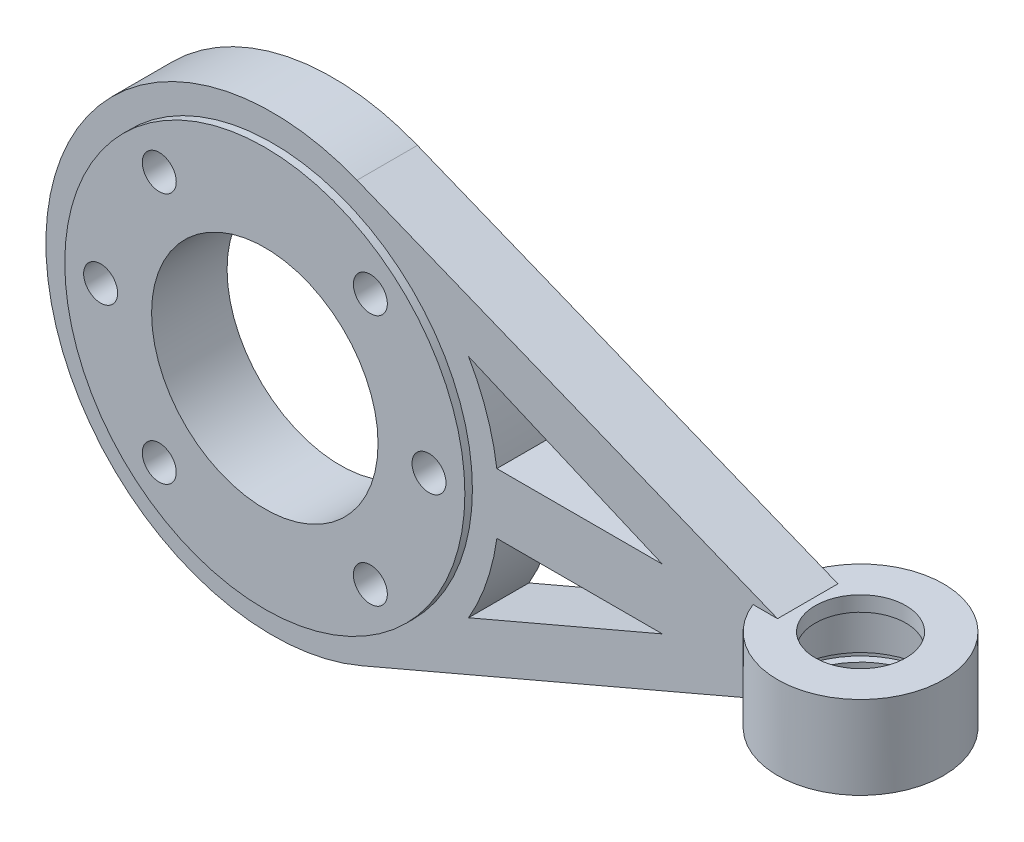
ISO-10303-21;
HEADER;
FILE_DESCRIPTION(('STEP AP214'),'2;1');
FILE_NAME('part.step','',(''),(''),'','','');
FILE_SCHEMA(('AUTOMOTIVE_DESIGN { 1 0 10303 214 1 1 1 1 }'));
ENDSEC;
DATA;
#1=APPLICATION_CONTEXT('core data for automotive mechanical design processes');
#2=APPLICATION_PROTOCOL_DEFINITION('international standard','automotive_design',2000,#1);
#3=PRODUCT_CONTEXT('',#1,'mechanical');
#4=PRODUCT('Part','Part','',(#3));
#5=PRODUCT_RELATED_PRODUCT_CATEGORY('part','',(#4));
#6=PRODUCT_DEFINITION_FORMATION('','',#4);
#7=PRODUCT_DEFINITION_CONTEXT('part definition',#1,'design');
#8=PRODUCT_DEFINITION('design','',#6,#7);
#9=PRODUCT_DEFINITION_SHAPE('','',#8);
#10=(LENGTH_UNIT() NAMED_UNIT(*) SI_UNIT(.MILLI.,.METRE.));
#11=(NAMED_UNIT(*) PLANE_ANGLE_UNIT() SI_UNIT($,.RADIAN.));
#12=(NAMED_UNIT(*) SI_UNIT($,.STERADIAN.) SOLID_ANGLE_UNIT());
#13=UNCERTAINTY_MEASURE_WITH_UNIT(LENGTH_MEASURE(1.E-05),#10,'distance_accuracy_value','');
#14=(GEOMETRIC_REPRESENTATION_CONTEXT(3) GLOBAL_UNCERTAINTY_ASSIGNED_CONTEXT((#13)) GLOBAL_UNIT_ASSIGNED_CONTEXT((#10,
#11,#12)) REPRESENTATION_CONTEXT('',''));
#15=CARTESIAN_POINT('',(0.,0.,0.));
#16=DIRECTION('',(0.,0.,1.));
#17=DIRECTION('',(1.,0.,0.));
#18=AXIS2_PLACEMENT_3D('',#15,#16,#17);
#19=CARTESIAN_POINT('',(73.9156216453703,30.8308441227157,3.));
#20=DIRECTION('',(0.,-1.,0.));
#21=DIRECTION('',(0.,0.,-1.));
#22=AXIS2_PLACEMENT_3D('',#19,#20,#21);
#23=CYLINDRICAL_SURFACE('',#22,9.);
#24=CARTESIAN_POINT('',(73.9156216453703,3.375,3.));
#25=DIRECTION('',(0.,1.,0.));
#26=DIRECTION('',(-1.,0.,0.));
#27=AXIS2_PLACEMENT_3D('',#24,#25,#26);
#28=CIRCLE('',#27,9.);
#29=CARTESIAN_POINT('',(64.9156216453703,3.375,3.));
#30=VERTEX_POINT('',#29);
#31=EDGE_CURVE('E181',#30,#30,#28,.F.);
#32=ORIENTED_EDGE('',*,*,#31,.F.);
#33=EDGE_LOOP('',(#32));
#34=FACE_BOUND('',#33,.T.);
#35=CARTESIAN_POINT('',(73.9156216453703,-3.37500000000002,3.));
#36=DIRECTION('',(0.,-1.,0.));
#37=DIRECTION('',(0.,0.,-1.));
#38=AXIS2_PLACEMENT_3D('',#35,#36,#37);
#39=CIRCLE('',#38,9.);
#40=CARTESIAN_POINT('',(73.9156216453703,-3.37500000000002,-6.));
#41=VERTEX_POINT('',#40);
#42=EDGE_CURVE('E166',#41,#41,#39,.T.);
#43=ORIENTED_EDGE('',*,*,#42,.T.);
#44=EDGE_LOOP('',(#43));
#45=FACE_BOUND('',#44,.T.);
#46=ADVANCED_FACE('F37',(#34,#45),#23,.F.);
#47=CARTESIAN_POINT('',(11.2147311143225,27.824985283616,7.));
#48=DIRECTION('',(-0.373824370477416,-0.927499509453867,0.));
#49=DIRECTION('',(0.927499509453867,-0.373824370477416,0.));
#50=AXIS2_PLACEMENT_3D('',#47,#48,#49);
#51=PLANE('',#50);
#52=DIRECTION('',(-0.927499509453867,0.373824370477416,0.));
#53=VECTOR('',#52,1.);
#54=CARTESIAN_POINT('',(11.2147311143225,27.824985283616,-1.));
#55=LINE('',#54,#53);
#56=CARTESIAN_POINT('',(66.9156216453703,5.375,-1.));
#57=VERTEX_POINT('',#56);
#58=CARTESIAN_POINT('',(11.2147311143225,27.824985283616,-1.));
#59=VERTEX_POINT('',#58);
#60=EDGE_CURVE('E200',#57,#59,#55,.T.);
#61=ORIENTED_EDGE('',*,*,#60,.T.);
#62=DIRECTION('',(0.,0.,-1.));
#63=VECTOR('',#62,1.);
#64=CARTESIAN_POINT('',(11.2147311143225,27.824985283616,7.));
#65=LINE('',#64,#63);
#66=CARTESIAN_POINT('',(11.2147311143225,27.824985283616,7.));
#67=VERTEX_POINT('',#66);
#68=EDGE_CURVE('E219',#67,#59,#65,.T.);
#69=ORIENTED_EDGE('',*,*,#68,.F.);
#70=DIRECTION('',(-0.927499509453867,0.373824370477416,0.));
#71=VECTOR('',#70,1.);
#72=CARTESIAN_POINT('',(11.2147311143225,27.824985283616,7.));
#73=LINE('',#72,#71);
#74=CARTESIAN_POINT('',(66.9156216453703,5.375,7.));
#75=VERTEX_POINT('',#74);
#76=EDGE_CURVE('E201',#75,#67,#73,.T.);
#77=ORIENTED_EDGE('',*,*,#76,.F.);
#78=DIRECTION('',(0.,0.,-1.));
#79=VECTOR('',#78,1.);
#80=CARTESIAN_POINT('',(66.9156216453703,5.375,7.));
#81=LINE('',#80,#79);
#82=EDGE_CURVE('E221',#75,#57,#81,.T.);
#83=ORIENTED_EDGE('',*,*,#82,.T.);
#84=EDGE_LOOP('',(#61,#69,#77,#83));
#85=FACE_BOUND('',#84,.T.);
#86=ADVANCED_FACE('F303',(#85),#51,.F.);
#87=CARTESIAN_POINT('',(11.8010452100285,-27.581430926456,7.));
#88=DIRECTION('',(-0.393368173667616,0.919381030881867,0.));
#89=DIRECTION('',(-0.919381030881867,-0.393368173667616,0.));
#90=AXIS2_PLACEMENT_3D('',#87,#88,#89);
#91=PLANE('',#90);
#92=DIRECTION('',(0.,0.,1.));
#93=VECTOR('',#92,1.);
#94=CARTESIAN_POINT('',(63.1176677813004,-5.62500000000001,7.));
#95=LINE('',#94,#93);
#96=CARTESIAN_POINT('',(63.1176677813004,-5.625,0.90138322950138));
#97=VERTEX_POINT('',#96);
#98=CARTESIAN_POINT('',(63.1176677813004,-5.625,5.09861677049862));
#99=VERTEX_POINT('',#98);
#100=EDGE_CURVE('E230',#97,#99,#95,.T.);
#101=ORIENTED_EDGE('',*,*,#100,.T.);
#102=CARTESIAN_POINT('',(73.9156216453703,-1.00496625100902,3.));
#103=DIRECTION('',(-0.393368173667616,0.919381030881867,0.));
#104=DIRECTION('',(0.919381030881867,0.393368173667616,0.));
#105=AXIS2_PLACEMENT_3D('',#102,#103,#104);
#106=ELLIPSE('',#105,11.9645714132788,11.);
#107=CARTESIAN_POINT('',(63.6686708794107,-5.38924673219444,7.));
#108=VERTEX_POINT('',#107);
#109=EDGE_CURVE('E196',#99,#108,#106,.T.);
#110=ORIENTED_EDGE('',*,*,#109,.T.);
#111=DIRECTION('',(0.919381030881867,0.393368173667616,0.));
#112=VECTOR('',#111,1.);
#113=CARTESIAN_POINT('',(11.8010452100285,-27.581430926456,7.));
#114=LINE('',#113,#112);
#115=CARTESIAN_POINT('',(11.8010452100285,-27.581430926456,7.));
#116=VERTEX_POINT('',#115);
#117=EDGE_CURVE('E207',#116,#108,#114,.T.);
#118=ORIENTED_EDGE('',*,*,#117,.F.);
#119=DIRECTION('',(0.,0.,-1.));
#120=VECTOR('',#119,1.);
#121=CARTESIAN_POINT('',(11.8010452100285,-27.581430926456,7.));
#122=LINE('',#121,#120);
#123=CARTESIAN_POINT('',(11.8010452100285,-27.581430926456,-1.));
#124=VERTEX_POINT('',#123);
#125=EDGE_CURVE('E210',#116,#124,#122,.T.);
#126=ORIENTED_EDGE('',*,*,#125,.T.);
#127=DIRECTION('',(0.919381030881867,0.393368173667616,0.));
#128=VECTOR('',#127,1.);
#129=CARTESIAN_POINT('',(11.8010452100285,-27.581430926456,-1.));
#130=LINE('',#129,#128);
#131=CARTESIAN_POINT('',(63.6686708794107,-5.38924673219444,-1.));
#132=VERTEX_POINT('',#131);
#133=EDGE_CURVE('E205',#124,#132,#130,.T.);
#134=ORIENTED_EDGE('',*,*,#133,.T.);
#135=EDGE_CURVE('E192',#132,#97,#106,.T.);
#136=ORIENTED_EDGE('',*,*,#135,.T.);
#137=EDGE_LOOP('',(#101,#110,#118,#126,#134,#136));
#138=FACE_BOUND('',#137,.T.);
#139=ADVANCED_FACE('F317',(#138),#91,.F.);
#140=CARTESIAN_POINT('',(0.,0.,7.));
#141=DIRECTION('',(0.,0.,1.));
#142=DIRECTION('',(1.,0.,0.));
#143=AXIS2_PLACEMENT_3D('',#140,#141,#142);
#144=PLANE('',#143);
#145=CARTESIAN_POINT('',(0.,0.,7.));
#146=DIRECTION('',(0.,0.,1.));
#147=DIRECTION('',(1.,0.,0.));
#148=AXIS2_PLACEMENT_3D('',#145,#146,#147);
#149=CIRCLE('',#148,30.);
#150=CARTESIAN_POINT('',(29.732137494637,-4.,7.));
#151=VERTEX_POINT('',#150);
#152=CARTESIAN_POINT('',(25.9896947238964,-14.9845176151477,7.));
#153=VERTEX_POINT('',#152);
#154=EDGE_CURVE('E155',#151,#153,#149,.F.);
#155=ORIENTED_EDGE('',*,*,#154,.F.);
#156=DIRECTION('',(-1.,0.,0.));
#157=VECTOR('',#156,1.);
#158=CARTESIAN_POINT('',(0.,-4.,7.));
#159=LINE('',#158,#157);
#160=CARTESIAN_POINT('',(51.6627354139849,-4.,7.));
#161=VERTEX_POINT('',#160);
#162=EDGE_CURVE('E153',#161,#151,#159,.T.);
#163=ORIENTED_EDGE('',*,*,#162,.F.);
#164=DIRECTION('',(0.919381030881867,0.393368173667616,0.));
#165=VECTOR('',#164,1.);
#166=CARTESIAN_POINT('',(9.44083616802279,-22.0651447411648,7.));
#167=LINE('',#166,#165);
#168=EDGE_CURVE('E148',#153,#161,#167,.T.);
#169=ORIENTED_EDGE('',*,*,#168,.F.);
#170=EDGE_LOOP('',(#155,#163,#169));
#171=FACE_BOUND('',#170,.T.);
#172=CARTESIAN_POINT('',(0.,0.,7.));
#173=DIRECTION('',(0.,0.,1.));
#174=DIRECTION('',(1.,0.,0.));
#175=AXIS2_PLACEMENT_3D('',#172,#173,#174);
#176=CIRCLE('',#175,30.);
#177=CARTESIAN_POINT('',(25.9896947238964,14.9845176151477,7.));
#178=VERTEX_POINT('',#177);
#179=CARTESIAN_POINT('',(29.732137494637,4.,7.));
#180=VERTEX_POINT('',#179);
#181=EDGE_CURVE('E146',#178,#180,#176,.F.);
#182=ORIENTED_EDGE('',*,*,#181,.F.);
#183=DIRECTION('',(-0.919381030881867,0.393368173667616,0.));
#184=VECTOR('',#183,1.);
#185=CARTESIAN_POINT('',(9.44083616802279,22.0651447411648,7.));
#186=LINE('',#185,#184);
#187=CARTESIAN_POINT('',(51.6627354139849,4.,7.));
#188=VERTEX_POINT('',#187);
#189=EDGE_CURVE('E132',#188,#178,#186,.T.);
#190=ORIENTED_EDGE('',*,*,#189,.F.);
#191=DIRECTION('',(1.,0.,0.));
#192=VECTOR('',#191,1.);
#193=CARTESIAN_POINT('',(0.,4.,7.));
#194=LINE('',#193,#192);
#195=EDGE_CURVE('E124',#180,#188,#194,.T.);
#196=ORIENTED_EDGE('',*,*,#195,.F.);
#197=EDGE_LOOP('',(#182,#190,#196));
#198=FACE_BOUND('',#197,.T.);
#199=CARTESIAN_POINT('',(0.,0.,7.));
#200=DIRECTION('',(0.,0.,1.));
#201=DIRECTION('',(1.,0.,0.));
#202=AXIS2_PLACEMENT_3D('',#199,#200,#201);
#203=CIRCLE('',#202,26.5);
#204=CARTESIAN_POINT('',(26.5,0.,7.));
#205=VERTEX_POINT('',#204);
#206=EDGE_CURVE('E161',#205,#205,#203,.F.);
#207=ORIENTED_EDGE('',*,*,#206,.T.);
#208=EDGE_LOOP('',(#207));
#209=FACE_BOUND('',#208,.T.);
#210=DIRECTION('',(-1.,0.,0.));
#211=VECTOR('',#210,1.);
#212=CARTESIAN_POINT('',(0.,5.37499999999998,7.));
#213=LINE('',#212,#211);
#214=CARTESIAN_POINT('',(63.6686708794107,5.375,7.));
#215=VERTEX_POINT('',#214);
#216=EDGE_CURVE('E198',#75,#215,#213,.T.);
#217=ORIENTED_EDGE('',*,*,#216,.F.);
#218=ORIENTED_EDGE('',*,*,#76,.T.);
#219=CARTESIAN_POINT('',(0.,0.,7.));
#220=DIRECTION('',(0.,0.,1.));
#221=DIRECTION('',(1.,0.,0.));
#222=AXIS2_PLACEMENT_3D('',#219,#220,#221);
#223=CIRCLE('',#222,30.);
#224=EDGE_CURVE('E204',#67,#116,#223,.T.);
#225=ORIENTED_EDGE('',*,*,#224,.T.);
#226=ORIENTED_EDGE('',*,*,#117,.T.);
#227=DIRECTION('',(0.,1.,0.));
#228=VECTOR('',#227,1.);
#229=CARTESIAN_POINT('',(63.6686708794107,22.7172907254557,7.));
#230=LINE('',#229,#228);
#231=EDGE_CURVE('E195',#215,#108,#230,.F.);
#232=ORIENTED_EDGE('',*,*,#231,.F.);
#233=EDGE_LOOP('',(#217,#218,#225,#226,#232));
#234=FACE_BOUND('',#233,.T.);
#235=ADVANCED_FACE('F144',(#171,#198,#209,#234),#144,.T.);
#236=CARTESIAN_POINT('',(0.,0.,-1.));
#237=DIRECTION('',(0.,0.,1.));
#238=DIRECTION('',(1.,0.,0.));
#239=AXIS2_PLACEMENT_3D('',#236,#237,#238);
#240=PLANE('',#239);
#241=DIRECTION('',(-1.,0.,0.));
#242=VECTOR('',#241,1.);
#243=CARTESIAN_POINT('',(0.,-4.,-1.));
#244=LINE('',#243,#242);
#245=CARTESIAN_POINT('',(51.6627354139849,-4.,-1.));
#246=VERTEX_POINT('',#245);
#247=CARTESIAN_POINT('',(29.732137494637,-4.,-1.));
#248=VERTEX_POINT('',#247);
#249=EDGE_CURVE('E45',#246,#248,#244,.T.);
#250=ORIENTED_EDGE('',*,*,#249,.T.);
#251=CARTESIAN_POINT('',(0.,0.,-1.));
#252=DIRECTION('',(0.,0.,1.));
#253=DIRECTION('',(1.,0.,0.));
#254=AXIS2_PLACEMENT_3D('',#251,#252,#253);
#255=CIRCLE('',#254,30.);
#256=CARTESIAN_POINT('',(25.9896947238964,-14.9845176151477,-1.));
#257=VERTEX_POINT('',#256);
#258=EDGE_CURVE('E12',#248,#257,#255,.F.);
#259=ORIENTED_EDGE('',*,*,#258,.T.);
#260=DIRECTION('',(0.919381030881867,0.393368173667616,0.));
#261=VECTOR('',#260,1.);
#262=CARTESIAN_POINT('',(9.44083616802279,-22.0651447411648,-1.));
#263=LINE('',#262,#261);
#264=EDGE_CURVE('E250',#257,#246,#263,.T.);
#265=ORIENTED_EDGE('',*,*,#264,.T.);
#266=EDGE_LOOP('',(#250,#259,#265));
#267=FACE_BOUND('',#266,.T.);
#268=DIRECTION('',(-0.919381030881867,0.393368173667616,0.));
#269=VECTOR('',#268,1.);
#270=CARTESIAN_POINT('',(9.44083616802279,22.0651447411648,-1.));
#271=LINE('',#270,#269);
#272=CARTESIAN_POINT('',(51.6627354139849,4.,-1.));
#273=VERTEX_POINT('',#272);
#274=CARTESIAN_POINT('',(25.9896947238964,14.9845176151477,-1.));
#275=VERTEX_POINT('',#274);
#276=EDGE_CURVE('E140',#273,#275,#271,.T.);
#277=ORIENTED_EDGE('',*,*,#276,.T.);
#278=CARTESIAN_POINT('',(0.,0.,-1.));
#279=DIRECTION('',(0.,0.,1.));
#280=DIRECTION('',(1.,0.,0.));
#281=AXIS2_PLACEMENT_3D('',#278,#279,#280);
#282=CIRCLE('',#281,30.);
#283=CARTESIAN_POINT('',(29.732137494637,4.,-1.));
#284=VERTEX_POINT('',#283);
#285=EDGE_CURVE('E247',#275,#284,#282,.F.);
#286=ORIENTED_EDGE('',*,*,#285,.T.);
#287=DIRECTION('',(1.,0.,0.));
#288=VECTOR('',#287,1.);
#289=CARTESIAN_POINT('',(0.,4.,-1.));
#290=LINE('',#289,#288);
#291=EDGE_CURVE('E240',#284,#273,#290,.T.);
#292=ORIENTED_EDGE('',*,*,#291,.T.);
#293=EDGE_LOOP('',(#277,#286,#292));
#294=FACE_BOUND('',#293,.T.);
#295=CARTESIAN_POINT('',(0.,0.,-1.));
#296=DIRECTION('',(0.,0.,1.));
#297=DIRECTION('',(1.,0.,0.));
#298=AXIS2_PLACEMENT_3D('',#295,#296,#297);
#299=CIRCLE('',#298,26.5);
#300=CARTESIAN_POINT('',(26.5,0.,-1.));
#301=VERTEX_POINT('',#300);
#302=EDGE_CURVE('E233',#301,#301,#299,.F.);
#303=ORIENTED_EDGE('',*,*,#302,.F.);
#304=EDGE_LOOP('',(#303));
#305=FACE_BOUND('',#304,.T.);
#306=ORIENTED_EDGE('',*,*,#60,.F.);
#307=DIRECTION('',(-1.,0.,0.));
#308=VECTOR('',#307,1.);
#309=CARTESIAN_POINT('',(0.,5.37499999999998,-1.));
#310=LINE('',#309,#308);
#311=CARTESIAN_POINT('',(63.6686708794107,5.375,-1.));
#312=VERTEX_POINT('',#311);
#313=EDGE_CURVE('E227',#57,#312,#310,.T.);
#314=ORIENTED_EDGE('',*,*,#313,.T.);
#315=DIRECTION('',(0.,1.,0.));
#316=VECTOR('',#315,1.);
#317=CARTESIAN_POINT('',(63.6686708794107,22.7172907254557,-1.));
#318=LINE('',#317,#316);
#319=EDGE_CURVE('E224',#312,#132,#318,.F.);
#320=ORIENTED_EDGE('',*,*,#319,.T.);
#321=ORIENTED_EDGE('',*,*,#133,.F.);
#322=CARTESIAN_POINT('',(0.,0.,-1.));
#323=DIRECTION('',(0.,0.,1.));
#324=DIRECTION('',(1.,0.,0.));
#325=AXIS2_PLACEMENT_3D('',#322,#323,#324);
#326=CIRCLE('',#325,30.);
#327=EDGE_CURVE('E213',#59,#124,#326,.T.);
#328=ORIENTED_EDGE('',*,*,#327,.F.);
#329=EDGE_LOOP('',(#306,#314,#320,#321,#328));
#330=FACE_BOUND('',#329,.T.);
#331=ADVANCED_FACE('F255',(#267,#294,#305,#330),#240,.F.);
#332=CARTESIAN_POINT('',(0.,0.,3.));
#333=DIRECTION('',(0.,0.,-1.));
#334=DIRECTION('',(-1.,0.,0.));
#335=AXIS2_PLACEMENT_3D('',#332,#333,#334);
#336=CYLINDRICAL_SURFACE('',#335,30.);
#337=ORIENTED_EDGE('',*,*,#327,.T.);
#338=ORIENTED_EDGE('',*,*,#125,.F.);
#339=ORIENTED_EDGE('',*,*,#224,.F.);
#340=ORIENTED_EDGE('',*,*,#68,.T.);
#341=EDGE_LOOP('',(#337,#338,#339,#340));
#342=FACE_BOUND('',#341,.T.);
#343=ADVANCED_FACE('F39',(#342),#336,.T.);
#344=CARTESIAN_POINT('',(62.9156216453703,-5.625,3.));
#345=DIRECTION('',(0.,-1.,0.));
#346=DIRECTION('',(1.,0.,0.));
#347=AXIS2_PLACEMENT_3D('',#344,#345,#346);
#348=PLANE('',#347);
#349=CARTESIAN_POINT('',(73.9156216453703,-5.62500000000002,3.));
#350=DIRECTION('',(0.,-1.,0.));
#351=DIRECTION('',(0.,0.,-1.));
#352=AXIS2_PLACEMENT_3D('',#349,#350,#351);
#353=CIRCLE('',#352,9.);
#354=CARTESIAN_POINT('',(73.9156216453703,-5.62500000000002,-6.));
#355=VERTEX_POINT('',#354);
#356=EDGE_CURVE('E174',#355,#355,#353,.T.);
#357=ORIENTED_EDGE('',*,*,#356,.F.);
#358=EDGE_LOOP('',(#357));
#359=FACE_BOUND('',#358,.T.);
#360=ORIENTED_EDGE('',*,*,#100,.F.);
#361=CARTESIAN_POINT('',(73.9156216453703,-5.625,3.));
#362=DIRECTION('',(0.,1.,0.));
#363=DIRECTION('',(-1.,0.,0.));
#364=AXIS2_PLACEMENT_3D('',#361,#362,#363);
#365=CIRCLE('',#364,11.);
#366=EDGE_CURVE('E185',#99,#97,#365,.T.);
#367=ORIENTED_EDGE('',*,*,#366,.F.);
#368=EDGE_LOOP('',(#360,#367));
#369=FACE_BOUND('',#368,.T.);
#370=ADVANCED_FACE('F319',(#359,#369),#348,.T.);
#371=CARTESIAN_POINT('',(73.9156216453703,22.7172907254557,3.));
#372=DIRECTION('',(0.,1.,0.));
#373=DIRECTION('',(-1.,0.,0.));
#374=AXIS2_PLACEMENT_3D('',#371,#372,#373);
#375=CYLINDRICAL_SURFACE('',#374,11.);
#376=ORIENTED_EDGE('',*,*,#109,.F.);
#377=ORIENTED_EDGE('',*,*,#366,.T.);
#378=ORIENTED_EDGE('',*,*,#135,.F.);
#379=ORIENTED_EDGE('',*,*,#319,.F.);
#380=CARTESIAN_POINT('',(73.9156216453703,5.375,3.));
#381=DIRECTION('',(0.,1.,0.));
#382=DIRECTION('',(-1.,0.,0.));
#383=AXIS2_PLACEMENT_3D('',#380,#381,#382);
#384=CIRCLE('',#383,11.);
#385=EDGE_CURVE('E188',#215,#312,#384,.T.);
#386=ORIENTED_EDGE('',*,*,#385,.F.);
#387=ORIENTED_EDGE('',*,*,#231,.T.);
#388=EDGE_LOOP('',(#376,#377,#378,#379,#386,#387));
#389=FACE_BOUND('',#388,.T.);
#390=ADVANCED_FACE('F314',(#389),#375,.T.);
#391=CARTESIAN_POINT('',(62.9156216453703,5.375,3.));
#392=DIRECTION('',(0.,1.,0.));
#393=DIRECTION('',(-1.,0.,0.));
#394=AXIS2_PLACEMENT_3D('',#391,#392,#393);
#395=PLANE('',#394);
#396=CARTESIAN_POINT('',(73.9156216453703,5.375,3.));
#397=DIRECTION('',(0.,1.,0.));
#398=DIRECTION('',(-1.,0.,0.));
#399=AXIS2_PLACEMENT_3D('',#396,#397,#398);
#400=CIRCLE('',#399,6.);
#401=CARTESIAN_POINT('',(67.9156216453703,5.375,3.));
#402=VERTEX_POINT('',#401);
#403=EDGE_CURVE('E189',#402,#402,#400,.T.);
#404=ORIENTED_EDGE('',*,*,#403,.F.);
#405=EDGE_LOOP('',(#404));
#406=FACE_BOUND('',#405,.T.);
#407=ORIENTED_EDGE('',*,*,#82,.F.);
#408=ORIENTED_EDGE('',*,*,#216,.T.);
#409=ORIENTED_EDGE('',*,*,#385,.T.);
#410=ORIENTED_EDGE('',*,*,#313,.F.);
#411=EDGE_LOOP('',(#407,#408,#409,#410));
#412=FACE_BOUND('',#411,.T.);
#413=ADVANCED_FACE('F306',(#406,#412),#395,.T.);
#414=CARTESIAN_POINT('',(73.9156216453703,19.375,3.));
#415=DIRECTION('',(0.,-1.,0.));
#416=DIRECTION('',(0.,0.,-1.));
#417=AXIS2_PLACEMENT_3D('',#414,#415,#416);
#418=CYLINDRICAL_SURFACE('',#417,6.);
#419=CARTESIAN_POINT('',(73.9156216453703,3.375,3.));
#420=DIRECTION('',(0.,1.,0.));
#421=DIRECTION('',(-1.,0.,0.));
#422=AXIS2_PLACEMENT_3D('',#419,#420,#421);
#423=CIRCLE('',#422,6.);
#424=CARTESIAN_POINT('',(67.9156216453703,3.375,3.));
#425=VERTEX_POINT('',#424);
#426=EDGE_CURVE('E184',#425,#425,#423,.F.);
#427=ORIENTED_EDGE('',*,*,#426,.T.);
#428=EDGE_LOOP('',(#427));
#429=FACE_BOUND('',#428,.T.);
#430=ORIENTED_EDGE('',*,*,#403,.T.);
#431=EDGE_LOOP('',(#430));
#432=FACE_BOUND('',#431,.T.);
#433=ADVANCED_FACE('F349',(#429,#432),#418,.F.);
#434=CARTESIAN_POINT('',(62.9156216453703,3.375,3.));
#435=DIRECTION('',(0.,1.,0.));
#436=DIRECTION('',(-1.,0.,0.));
#437=AXIS2_PLACEMENT_3D('',#434,#435,#436);
#438=PLANE('',#437);
#439=ORIENTED_EDGE('',*,*,#31,.T.);
#440=EDGE_LOOP('',(#439));
#441=FACE_BOUND('',#440,.T.);
#442=ORIENTED_EDGE('',*,*,#426,.F.);
#443=EDGE_LOOP('',(#442));
#444=FACE_BOUND('',#443,.T.);
#445=ADVANCED_FACE('F341',(#441,#444),#438,.F.);
#446=CARTESIAN_POINT('',(73.9156216453703,-4.47500000000002,3.));
#447=DIRECTION('',(0.,-1.,0.));
#448=DIRECTION('',(0.,0.,-1.));
#449=AXIS2_PLACEMENT_3D('',#446,#447,#448);
#450=CIRCLE('',#449,9.);
#451=CARTESIAN_POINT('',(73.9156216453703,-4.47500000000002,-6.));
#452=VERTEX_POINT('',#451);
#453=EDGE_CURVE('E167',#452,#452,#450,.T.);
#454=ORIENTED_EDGE('',*,*,#453,.F.);
#455=EDGE_LOOP('',(#454));
#456=FACE_BOUND('',#455,.T.);
#457=ORIENTED_EDGE('',*,*,#356,.T.);
#458=EDGE_LOOP('',(#457));
#459=FACE_BOUND('',#458,.T.);
#460=ADVANCED_FACE('F331',(#456,#459),#23,.F.);
#461=CARTESIAN_POINT('',(73.9156216453703,-4.47500000000002,3.));
#462=DIRECTION('',(0.,1.,0.));
#463=DIRECTION('',(0.,0.,1.));
#464=AXIS2_PLACEMENT_3D('',#461,#462,#463);
#465=CYLINDRICAL_SURFACE('',#464,9.99999999999999);
#466=CARTESIAN_POINT('',(73.9156216453703,-4.47500000000002,3.));
#467=DIRECTION('',(0.,-1.,0.));
#468=DIRECTION('',(0.,0.,-1.));
#469=AXIS2_PLACEMENT_3D('',#466,#467,#468);
#470=CIRCLE('',#469,9.99999999999999);
#471=CARTESIAN_POINT('',(73.9156216453703,-4.47500000000002,-6.99999999999999));
#472=VERTEX_POINT('',#471);
#473=EDGE_CURVE('E170',#472,#472,#470,.T.);
#474=ORIENTED_EDGE('',*,*,#473,.T.);
#475=EDGE_LOOP('',(#474));
#476=FACE_BOUND('',#475,.T.);
#477=CARTESIAN_POINT('',(73.9156216453703,-3.37500000000002,3.));
#478=DIRECTION('',(0.,-1.,0.));
#479=DIRECTION('',(0.,0.,-1.));
#480=AXIS2_PLACEMENT_3D('',#477,#478,#479);
#481=CIRCLE('',#480,9.99999999999999);
#482=CARTESIAN_POINT('',(73.9156216453703,-3.37500000000002,-6.99999999999999));
#483=VERTEX_POINT('',#482);
#484=EDGE_CURVE('E171',#483,#483,#481,.T.);
#485=ORIENTED_EDGE('',*,*,#484,.F.);
#486=EDGE_LOOP('',(#485));
#487=FACE_BOUND('',#486,.T.);
#488=ADVANCED_FACE('F340',(#476,#487),#465,.F.);
#489=CARTESIAN_POINT('',(0.,-4.47500000000002,0.));
#490=DIRECTION('',(0.,-1.,0.));
#491=DIRECTION('',(0.,0.,-1.));
#492=AXIS2_PLACEMENT_3D('',#489,#490,#491);
#493=PLANE('',#492);
#494=ORIENTED_EDGE('',*,*,#453,.T.);
#495=EDGE_LOOP('',(#494));
#496=FACE_BOUND('',#495,.T.);
#497=ORIENTED_EDGE('',*,*,#473,.F.);
#498=EDGE_LOOP('',(#497));
#499=FACE_BOUND('',#498,.T.);
#500=ADVANCED_FACE('F347',(#496,#499),#493,.F.);
#501=CARTESIAN_POINT('',(0.,-3.37500000000002,0.));
#502=DIRECTION('',(0.,-1.,0.));
#503=DIRECTION('',(0.,0.,-1.));
#504=AXIS2_PLACEMENT_3D('',#501,#502,#503);
#505=PLANE('',#504);
#506=ORIENTED_EDGE('',*,*,#42,.F.);
#507=EDGE_LOOP('',(#506));
#508=FACE_BOUND('',#507,.T.);
#509=ORIENTED_EDGE('',*,*,#484,.T.);
#510=EDGE_LOOP('',(#509));
#511=FACE_BOUND('',#510,.T.);
#512=ADVANCED_FACE('F284',(#508,#511),#505,.T.);
#513=CARTESIAN_POINT('',(0.,0.,-2.));
#514=DIRECTION('',(0.,0.,-1.));
#515=DIRECTION('',(-1.,0.,0.));
#516=AXIS2_PLACEMENT_3D('',#513,#514,#515);
#517=PLANE('',#516);
#518=CARTESIAN_POINT('',(21.75,0.,-2.));
#519=DIRECTION('',(0.,0.,-1.));
#520=DIRECTION('',(-1.,0.,0.));
#521=AXIS2_PLACEMENT_3D('',#518,#519,#520);
#522=CIRCLE('',#521,2.25);
#523=CARTESIAN_POINT('',(19.5,0.,-2.));
#524=VERTEX_POINT('',#523);
#525=EDGE_CURVE('E269',#524,#524,#522,.T.);
#526=ORIENTED_EDGE('',*,*,#525,.F.);
#527=EDGE_LOOP('',(#526));
#528=FACE_BOUND('',#527,.T.);
#529=CARTESIAN_POINT('',(-13.9806305106822,16.6614666378378,-2.));
#530=DIRECTION('',(0.,0.,-1.));
#531=DIRECTION('',(-1.,0.,0.));
#532=AXIS2_PLACEMENT_3D('',#529,#530,#531);
#533=CIRCLE('',#532,2.25);
#534=CARTESIAN_POINT('',(-16.2306305106822,16.6614666378378,-2.));
#535=VERTEX_POINT('',#534);
#536=EDGE_CURVE('E452',#535,#535,#533,.T.);
#537=ORIENTED_EDGE('',*,*,#536,.F.);
#538=EDGE_LOOP('',(#537));
#539=FACE_BOUND('',#538,.T.);
#540=CARTESIAN_POINT('',(13.9806305106822,-16.6614666378378,-2.));
#541=DIRECTION('',(0.,0.,-1.));
#542=DIRECTION('',(-1.,0.,0.));
#543=AXIS2_PLACEMENT_3D('',#540,#541,#542);
#544=CIRCLE('',#543,2.25);
#545=CARTESIAN_POINT('',(11.7306305106822,-16.6614666378378,-2.));
#546=VERTEX_POINT('',#545);
#547=EDGE_CURVE('E450',#546,#546,#544,.T.);
#548=ORIENTED_EDGE('',*,*,#547,.F.);
#549=EDGE_LOOP('',(#548));
#550=FACE_BOUND('',#549,.T.);
#551=CARTESIAN_POINT('',(-21.75,0.,-2.));
#552=DIRECTION('',(0.,0.,-1.));
#553=DIRECTION('',(-1.,0.,0.));
#554=AXIS2_PLACEMENT_3D('',#551,#552,#553);
#555=CIRCLE('',#554,2.25);
#556=CARTESIAN_POINT('',(-24.,0.,-2.));
#557=VERTEX_POINT('',#556);
#558=EDGE_CURVE('E447',#557,#557,#555,.T.);
#559=ORIENTED_EDGE('',*,*,#558,.F.);
#560=EDGE_LOOP('',(#559));
#561=FACE_BOUND('',#560,.T.);
#562=CARTESIAN_POINT('',(-13.9806305106822,-16.6614666378378,-2.));
#563=DIRECTION('',(0.,0.,-1.));
#564=DIRECTION('',(-1.,0.,0.));
#565=AXIS2_PLACEMENT_3D('',#562,#563,#564);
#566=CIRCLE('',#565,2.25);
#567=CARTESIAN_POINT('',(-16.2306305106822,-16.6614666378378,-2.));
#568=VERTEX_POINT('',#567);
#569=EDGE_CURVE('E428',#568,#568,#566,.T.);
#570=ORIENTED_EDGE('',*,*,#569,.F.);
#571=EDGE_LOOP('',(#570));
#572=FACE_BOUND('',#571,.T.);
#573=CARTESIAN_POINT('',(13.9806305106822,16.6614666378378,-2.));
#574=DIRECTION('',(0.,0.,-1.));
#575=DIRECTION('',(-1.,0.,0.));
#576=AXIS2_PLACEMENT_3D('',#573,#574,#575);
#577=CIRCLE('',#576,2.25);
#578=CARTESIAN_POINT('',(11.7306305106822,16.6614666378378,-2.));
#579=VERTEX_POINT('',#578);
#580=EDGE_CURVE('E424',#579,#579,#577,.T.);
#581=ORIENTED_EDGE('',*,*,#580,.F.);
#582=EDGE_LOOP('',(#581));
#583=FACE_BOUND('',#582,.T.);
#584=CARTESIAN_POINT('',(0.,0.,-2.));
#585=DIRECTION('',(0.,0.,-1.));
#586=DIRECTION('',(-1.,0.,0.));
#587=AXIS2_PLACEMENT_3D('',#584,#585,#586);
#588=CIRCLE('',#587,15.);
#589=CARTESIAN_POINT('',(-15.,0.,-2.));
#590=VERTEX_POINT('',#589);
#591=EDGE_CURVE('E133',#590,#590,#588,.T.);
#592=ORIENTED_EDGE('',*,*,#591,.F.);
#593=EDGE_LOOP('',(#592));
#594=FACE_BOUND('',#593,.T.);
#595=CARTESIAN_POINT('',(0.,0.,-2.));
#596=DIRECTION('',(0.,0.,-1.));
#597=DIRECTION('',(-1.,0.,0.));
#598=AXIS2_PLACEMENT_3D('',#595,#596,#597);
#599=CIRCLE('',#598,26.5);
#600=CARTESIAN_POINT('',(-26.5,0.,-2.));
#601=VERTEX_POINT('',#600);
#602=EDGE_CURVE('E158',#601,#601,#599,.T.);
#603=ORIENTED_EDGE('',*,*,#602,.T.);
#604=EDGE_LOOP('',(#603));
#605=FACE_BOUND('',#604,.T.);
#606=ADVANCED_FACE('F280',(#528,#539,#550,#561,#572,#583,#594,#605),#517,.T.);
#607=CARTESIAN_POINT('',(0.,0.,-2.));
#608=DIRECTION('',(0.,0.,1.));
#609=DIRECTION('',(1.,0.,0.));
#610=AXIS2_PLACEMENT_3D('',#607,#608,#609);
#611=CYLINDRICAL_SURFACE('',#610,26.5);
#612=ORIENTED_EDGE('',*,*,#602,.F.);
#613=EDGE_LOOP('',(#612));
#614=FACE_BOUND('',#613,.T.);
#615=ORIENTED_EDGE('',*,*,#302,.T.);
#616=EDGE_LOOP('',(#615));
#617=FACE_BOUND('',#616,.T.);
#618=ADVANCED_FACE('F283',(#614,#617),#611,.T.);
#619=ORIENTED_EDGE('',*,*,#206,.F.);
#620=EDGE_LOOP('',(#619));
#621=FACE_BOUND('',#620,.T.);
#622=CARTESIAN_POINT('',(0.,0.,8.));
#623=DIRECTION('',(0.,0.,-1.));
#624=DIRECTION('',(-1.,0.,0.));
#625=AXIS2_PLACEMENT_3D('',#622,#623,#624);
#626=CIRCLE('',#625,26.5);
#627=CARTESIAN_POINT('',(-26.5,0.,8.));
#628=VERTEX_POINT('',#627);
#629=EDGE_CURVE('E157',#628,#628,#626,.T.);
#630=ORIENTED_EDGE('',*,*,#629,.T.);
#631=EDGE_LOOP('',(#630));
#632=FACE_BOUND('',#631,.T.);
#633=ADVANCED_FACE('F291',(#621,#632),#611,.T.);
#634=CARTESIAN_POINT('',(0.,0.,8.));
#635=DIRECTION('',(0.,0.,-1.));
#636=DIRECTION('',(-1.,0.,0.));
#637=AXIS2_PLACEMENT_3D('',#634,#635,#636);
#638=PLANE('',#637);
#639=CARTESIAN_POINT('',(21.75,0.,8.));
#640=DIRECTION('',(0.,0.,1.));
#641=DIRECTION('',(1.,0.,0.));
#642=AXIS2_PLACEMENT_3D('',#639,#640,#641);
#643=CIRCLE('',#642,2.25);
#644=CARTESIAN_POINT('',(24.,0.,8.));
#645=VERTEX_POINT('',#644);
#646=EDGE_CURVE('E423',#645,#645,#643,.T.);
#647=ORIENTED_EDGE('',*,*,#646,.F.);
#648=EDGE_LOOP('',(#647));
#649=FACE_BOUND('',#648,.T.);
#650=CARTESIAN_POINT('',(-13.9806305106822,16.6614666378378,8.));
#651=DIRECTION('',(0.,0.,1.));
#652=DIRECTION('',(1.,0.,0.));
#653=AXIS2_PLACEMENT_3D('',#650,#651,#652);
#654=CIRCLE('',#653,2.25);
#655=CARTESIAN_POINT('',(-11.7306305106822,16.6614666378378,8.));
#656=VERTEX_POINT('',#655);
#657=EDGE_CURVE('E434',#656,#656,#654,.T.);
#658=ORIENTED_EDGE('',*,*,#657,.F.);
#659=EDGE_LOOP('',(#658));
#660=FACE_BOUND('',#659,.T.);
#661=CARTESIAN_POINT('',(13.9806305106822,-16.6614666378378,8.));
#662=DIRECTION('',(0.,0.,1.));
#663=DIRECTION('',(1.,0.,0.));
#664=AXIS2_PLACEMENT_3D('',#661,#662,#663);
#665=CIRCLE('',#664,2.25);
#666=CARTESIAN_POINT('',(16.2306305106822,-16.6614666378378,8.));
#667=VERTEX_POINT('',#666);
#668=EDGE_CURVE('E425',#667,#667,#665,.T.);
#669=ORIENTED_EDGE('',*,*,#668,.F.);
#670=EDGE_LOOP('',(#669));
#671=FACE_BOUND('',#670,.T.);
#672=CARTESIAN_POINT('',(-21.75,0.,8.));
#673=DIRECTION('',(0.,0.,1.));
#674=DIRECTION('',(-1.,0.,0.));
#675=AXIS2_PLACEMENT_3D('',#672,#673,#674);
#676=CIRCLE('',#675,2.25);
#677=CARTESIAN_POINT('',(-24.,0.,8.));
#678=VERTEX_POINT('',#677);
#679=EDGE_CURVE('E431',#678,#678,#676,.T.);
#680=ORIENTED_EDGE('',*,*,#679,.F.);
#681=EDGE_LOOP('',(#680));
#682=FACE_BOUND('',#681,.T.);
#683=CARTESIAN_POINT('',(-13.9806305106822,-16.6614666378378,8.));
#684=DIRECTION('',(0.,0.,1.));
#685=DIRECTION('',(-1.,0.,0.));
#686=AXIS2_PLACEMENT_3D('',#683,#684,#685);
#687=CIRCLE('',#686,2.25);
#688=CARTESIAN_POINT('',(-16.2306305106822,-16.6614666378378,8.));
#689=VERTEX_POINT('',#688);
#690=EDGE_CURVE('E438',#689,#689,#687,.T.);
#691=ORIENTED_EDGE('',*,*,#690,.F.);
#692=EDGE_LOOP('',(#691));
#693=FACE_BOUND('',#692,.T.);
#694=CARTESIAN_POINT('',(13.9806305106822,16.6614666378378,8.));
#695=DIRECTION('',(0.,0.,1.));
#696=DIRECTION('',(-1.,0.,0.));
#697=AXIS2_PLACEMENT_3D('',#694,#695,#696);
#698=CIRCLE('',#697,2.25);
#699=CARTESIAN_POINT('',(11.7306305106822,16.6614666378378,8.));
#700=VERTEX_POINT('',#699);
#701=EDGE_CURVE('E437',#700,#700,#698,.T.);
#702=ORIENTED_EDGE('',*,*,#701,.F.);
#703=EDGE_LOOP('',(#702));
#704=FACE_BOUND('',#703,.T.);
#705=CARTESIAN_POINT('',(0.,0.,8.));
#706=DIRECTION('',(0.,0.,-1.));
#707=DIRECTION('',(-1.,0.,0.));
#708=AXIS2_PLACEMENT_3D('',#705,#706,#707);
#709=CIRCLE('',#708,15.);
#710=CARTESIAN_POINT('',(-15.,0.,8.));
#711=VERTEX_POINT('',#710);
#712=EDGE_CURVE('E241',#711,#711,#709,.T.);
#713=ORIENTED_EDGE('',*,*,#712,.T.);
#714=EDGE_LOOP('',(#713));
#715=FACE_BOUND('',#714,.T.);
#716=ORIENTED_EDGE('',*,*,#629,.F.);
#717=EDGE_LOOP('',(#716));
#718=FACE_BOUND('',#717,.T.);
#719=ADVANCED_FACE('F370',(#649,#660,#671,#682,#693,#704,#715,#718),#638,.F.);
#720=CARTESIAN_POINT('',(0.,0.,-8.));
#721=DIRECTION('',(0.,0.,1.));
#722=DIRECTION('',(1.,0.,0.));
#723=AXIS2_PLACEMENT_3D('',#720,#721,#722);
#724=CYLINDRICAL_SURFACE('',#723,15.);
#725=ORIENTED_EDGE('',*,*,#591,.T.);
#726=EDGE_LOOP('',(#725));
#727=FACE_BOUND('',#726,.T.);
#728=ORIENTED_EDGE('',*,*,#712,.F.);
#729=EDGE_LOOP('',(#728));
#730=FACE_BOUND('',#729,.T.);
#731=ADVANCED_FACE('F277',(#727,#730),#724,.F.);
#732=CARTESIAN_POINT('',(0.,0.,-8.));
#733=DIRECTION('',(0.,0.,1.));
#734=DIRECTION('',(1.,0.,0.));
#735=AXIS2_PLACEMENT_3D('',#732,#733,#734);
#736=CYLINDRICAL_SURFACE('',#735,30.);
#737=ORIENTED_EDGE('',*,*,#181,.T.);
#738=DIRECTION('',(0.,0.,1.));
#739=VECTOR('',#738,1.);
#740=CARTESIAN_POINT('',(29.732137494637,4.,-8.));
#741=LINE('',#740,#739);
#742=EDGE_CURVE('E60',#284,#180,#741,.T.);
#743=ORIENTED_EDGE('',*,*,#742,.F.);
#744=ORIENTED_EDGE('',*,*,#285,.F.);
#745=DIRECTION('',(0.,0.,1.));
#746=VECTOR('',#745,1.);
#747=CARTESIAN_POINT('',(25.9896947238964,14.9845176151477,-8.));
#748=LINE('',#747,#746);
#749=EDGE_CURVE('E142',#275,#178,#748,.T.);
#750=ORIENTED_EDGE('',*,*,#749,.T.);
#751=EDGE_LOOP('',(#737,#743,#744,#750));
#752=FACE_BOUND('',#751,.T.);
#753=ADVANCED_FACE('F375',(#752),#736,.T.);
#754=CARTESIAN_POINT('',(25.9896947238964,14.9845176151477,-8.));
#755=DIRECTION('',(0.393368173667616,0.919381030881867,0.));
#756=DIRECTION('',(-0.919381030881867,0.393368173667616,0.));
#757=AXIS2_PLACEMENT_3D('',#754,#755,#756);
#758=PLANE('',#757);
#759=ORIENTED_EDGE('',*,*,#189,.T.);
#760=ORIENTED_EDGE('',*,*,#749,.F.);
#761=ORIENTED_EDGE('',*,*,#276,.F.);
#762=DIRECTION('',(0.,0.,1.));
#763=VECTOR('',#762,1.);
#764=CARTESIAN_POINT('',(51.6627354139849,4.,-8.));
#765=LINE('',#764,#763);
#766=EDGE_CURVE('E127',#273,#188,#765,.T.);
#767=ORIENTED_EDGE('',*,*,#766,.T.);
#768=EDGE_LOOP('',(#759,#760,#761,#767));
#769=FACE_BOUND('',#768,.T.);
#770=ADVANCED_FACE('F136',(#769),#758,.F.);
#771=CARTESIAN_POINT('',(29.732137494637,4.,-8.));
#772=DIRECTION('',(0.,-1.,0.));
#773=DIRECTION('',(0.,0.,-1.));
#774=AXIS2_PLACEMENT_3D('',#771,#772,#773);
#775=PLANE('',#774);
#776=ORIENTED_EDGE('',*,*,#195,.T.);
#777=ORIENTED_EDGE('',*,*,#766,.F.);
#778=ORIENTED_EDGE('',*,*,#291,.F.);
#779=ORIENTED_EDGE('',*,*,#742,.T.);
#780=EDGE_LOOP('',(#776,#777,#778,#779));
#781=FACE_BOUND('',#780,.T.);
#782=ADVANCED_FACE('F126',(#781),#775,.F.);
#783=CARTESIAN_POINT('',(0.,0.,-8.));
#784=DIRECTION('',(0.,0.,1.));
#785=DIRECTION('',(1.,0.,0.));
#786=AXIS2_PLACEMENT_3D('',#783,#784,#785);
#787=CYLINDRICAL_SURFACE('',#786,30.);
#788=ORIENTED_EDGE('',*,*,#154,.T.);
#789=DIRECTION('',(0.,0.,1.));
#790=VECTOR('',#789,1.);
#791=CARTESIAN_POINT('',(25.9896947238964,-14.9845176151477,-8.));
#792=LINE('',#791,#790);
#793=EDGE_CURVE('E52',#257,#153,#792,.T.);
#794=ORIENTED_EDGE('',*,*,#793,.F.);
#795=ORIENTED_EDGE('',*,*,#258,.F.);
#796=DIRECTION('',(0.,0.,1.));
#797=VECTOR('',#796,1.);
#798=CARTESIAN_POINT('',(29.732137494637,-4.,-8.));
#799=LINE('',#798,#797);
#800=EDGE_CURVE('E244',#248,#151,#799,.T.);
#801=ORIENTED_EDGE('',*,*,#800,.T.);
#802=EDGE_LOOP('',(#788,#794,#795,#801));
#803=FACE_BOUND('',#802,.T.);
#804=ADVANCED_FACE('F381',(#803),#787,.T.);
#805=CARTESIAN_POINT('',(29.732137494637,-4.,-8.));
#806=DIRECTION('',(0.,1.,0.));
#807=DIRECTION('',(0.,0.,1.));
#808=AXIS2_PLACEMENT_3D('',#805,#806,#807);
#809=PLANE('',#808);
#810=ORIENTED_EDGE('',*,*,#162,.T.);
#811=ORIENTED_EDGE('',*,*,#800,.F.);
#812=ORIENTED_EDGE('',*,*,#249,.F.);
#813=DIRECTION('',(0.,0.,1.));
#814=VECTOR('',#813,1.);
#815=CARTESIAN_POINT('',(51.6627354139849,-4.,-8.));
#816=LINE('',#815,#814);
#817=EDGE_CURVE('E261',#246,#161,#816,.T.);
#818=ORIENTED_EDGE('',*,*,#817,.T.);
#819=EDGE_LOOP('',(#810,#811,#812,#818));
#820=FACE_BOUND('',#819,.T.);
#821=ADVANCED_FACE('F260',(#820),#809,.F.);
#822=CARTESIAN_POINT('',(25.9896947238964,-14.9845176151477,-8.));
#823=DIRECTION('',(0.393368173667616,-0.919381030881867,0.));
#824=DIRECTION('',(0.919381030881867,0.393368173667616,0.));
#825=AXIS2_PLACEMENT_3D('',#822,#823,#824);
#826=PLANE('',#825);
#827=ORIENTED_EDGE('',*,*,#168,.T.);
#828=ORIENTED_EDGE('',*,*,#817,.F.);
#829=ORIENTED_EDGE('',*,*,#264,.F.);
#830=ORIENTED_EDGE('',*,*,#793,.T.);
#831=EDGE_LOOP('',(#827,#828,#829,#830));
#832=FACE_BOUND('',#831,.T.);
#833=ADVANCED_FACE('F386',(#832),#826,.F.);
#834=CARTESIAN_POINT('',(13.9806305106822,16.6614666378378,-9.));
#835=DIRECTION('',(0.,0.,1.));
#836=DIRECTION('',(1.,0.,0.));
#837=AXIS2_PLACEMENT_3D('',#834,#835,#836);
#838=CYLINDRICAL_SURFACE('',#837,2.25);
#839=ORIENTED_EDGE('',*,*,#580,.T.);
#840=EDGE_LOOP('',(#839));
#841=FACE_BOUND('',#840,.T.);
#842=ORIENTED_EDGE('',*,*,#701,.T.);
#843=EDGE_LOOP('',(#842));
#844=FACE_BOUND('',#843,.T.);
#845=ADVANCED_FACE('F389',(#841,#844),#838,.F.);
#846=CARTESIAN_POINT('',(-13.9806305106822,-16.6614666378378,-9.));
#847=DIRECTION('',(0.,0.,1.));
#848=DIRECTION('',(1.,0.,0.));
#849=AXIS2_PLACEMENT_3D('',#846,#847,#848);
#850=CYLINDRICAL_SURFACE('',#849,2.25);
#851=ORIENTED_EDGE('',*,*,#569,.T.);
#852=EDGE_LOOP('',(#851));
#853=FACE_BOUND('',#852,.T.);
#854=ORIENTED_EDGE('',*,*,#690,.T.);
#855=EDGE_LOOP('',(#854));
#856=FACE_BOUND('',#855,.T.);
#857=ADVANCED_FACE('F398',(#853,#856),#850,.F.);
#858=CARTESIAN_POINT('',(-21.75,0.,-9.));
#859=DIRECTION('',(0.,0.,1.));
#860=DIRECTION('',(1.,0.,0.));
#861=AXIS2_PLACEMENT_3D('',#858,#859,#860);
#862=CYLINDRICAL_SURFACE('',#861,2.25);
#863=ORIENTED_EDGE('',*,*,#558,.T.);
#864=EDGE_LOOP('',(#863));
#865=FACE_BOUND('',#864,.T.);
#866=ORIENTED_EDGE('',*,*,#679,.T.);
#867=EDGE_LOOP('',(#866));
#868=FACE_BOUND('',#867,.T.);
#869=ADVANCED_FACE('F394',(#865,#868),#862,.F.);
#870=CARTESIAN_POINT('',(13.9806305106822,-16.6614666378378,-9.));
#871=DIRECTION('',(0.,0.,1.));
#872=DIRECTION('',(1.,0.,0.));
#873=AXIS2_PLACEMENT_3D('',#870,#871,#872);
#874=CYLINDRICAL_SURFACE('',#873,2.25);
#875=ORIENTED_EDGE('',*,*,#547,.T.);
#876=EDGE_LOOP('',(#875));
#877=FACE_BOUND('',#876,.T.);
#878=ORIENTED_EDGE('',*,*,#668,.T.);
#879=EDGE_LOOP('',(#878));
#880=FACE_BOUND('',#879,.T.);
#881=ADVANCED_FACE('F397',(#877,#880),#874,.F.);
#882=CARTESIAN_POINT('',(-13.9806305106822,16.6614666378378,-9.));
#883=DIRECTION('',(0.,0.,1.));
#884=DIRECTION('',(1.,0.,0.));
#885=AXIS2_PLACEMENT_3D('',#882,#883,#884);
#886=CYLINDRICAL_SURFACE('',#885,2.25);
#887=ORIENTED_EDGE('',*,*,#536,.T.);
#888=EDGE_LOOP('',(#887));
#889=FACE_BOUND('',#888,.T.);
#890=ORIENTED_EDGE('',*,*,#657,.T.);
#891=EDGE_LOOP('',(#890));
#892=FACE_BOUND('',#891,.T.);
#893=ADVANCED_FACE('F402',(#889,#892),#886,.F.);
#894=CARTESIAN_POINT('',(21.75,0.,-9.));
#895=DIRECTION('',(0.,0.,1.));
#896=DIRECTION('',(1.,0.,0.));
#897=AXIS2_PLACEMENT_3D('',#894,#895,#896);
#898=CYLINDRICAL_SURFACE('',#897,2.25);
#899=ORIENTED_EDGE('',*,*,#525,.T.);
#900=EDGE_LOOP('',(#899));
#901=FACE_BOUND('',#900,.T.);
#902=ORIENTED_EDGE('',*,*,#646,.T.);
#903=EDGE_LOOP('',(#902));
#904=FACE_BOUND('',#903,.T.);
#905=ADVANCED_FACE('F412',(#901,#904),#898,.F.);
#906=CLOSED_SHELL('',(#46,#86,#139,#235,#331,#343,#370,#390,#413,#433,#445,#460,#488,#500,#512,
#606,#618,#633,#719,#731,#753,#770,#782,#804,#821,#833,#845,#857,#869,#881,#893,#905));
#907=MANIFOLD_SOLID_BREP('B2',#906);
#908=ADVANCED_BREP_SHAPE_REPRESENTATION('',(#18,#907),#14);
#909=SHAPE_DEFINITION_REPRESENTATION(#9,#908);
ENDSEC;
END-ISO-10303-21;
